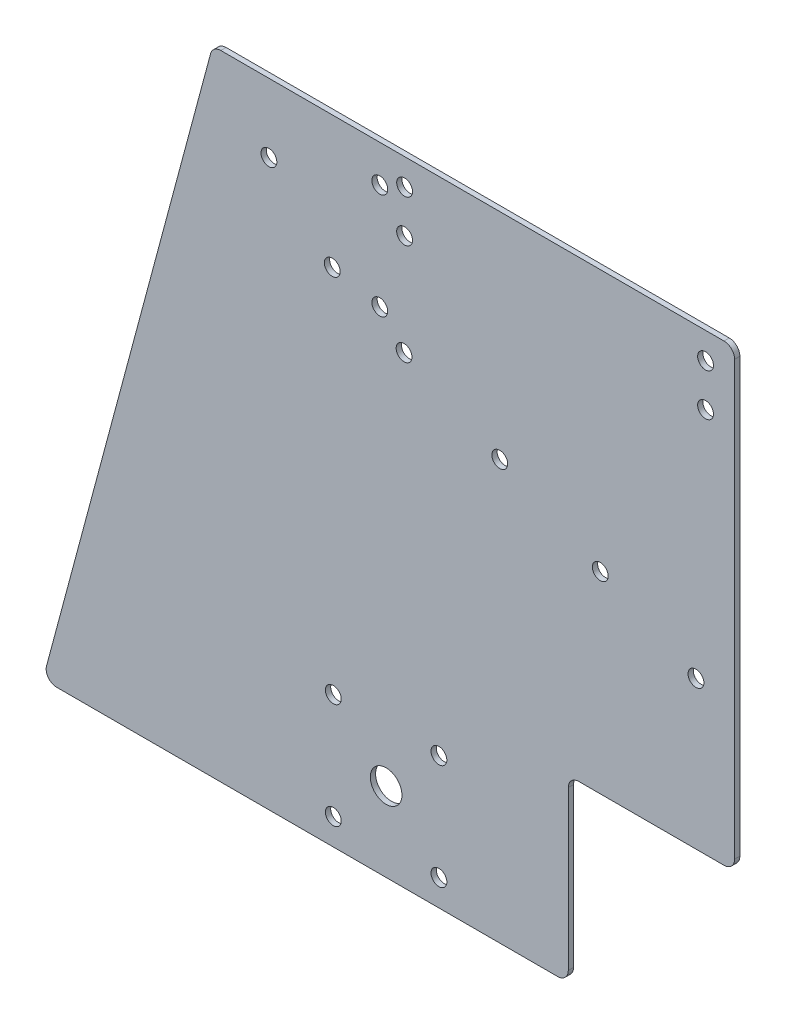
ISO-10303-21;
HEADER;
FILE_DESCRIPTION(('STEP AP214'),'2;1');
FILE_NAME('part.step','',(''),(''),'','','');
FILE_SCHEMA(('AUTOMOTIVE_DESIGN { 1 0 10303 214 1 1 1 1 }'));
ENDSEC;
DATA;
#1=APPLICATION_CONTEXT('core data for automotive mechanical design processes');
#2=APPLICATION_PROTOCOL_DEFINITION('international standard','automotive_design',2000,#1);
#3=PRODUCT_CONTEXT('',#1,'mechanical');
#4=PRODUCT('Part','Part','',(#3));
#5=PRODUCT_RELATED_PRODUCT_CATEGORY('part','',(#4));
#6=PRODUCT_DEFINITION_FORMATION('','',#4);
#7=PRODUCT_DEFINITION_CONTEXT('part definition',#1,'design');
#8=PRODUCT_DEFINITION('design','',#6,#7);
#9=PRODUCT_DEFINITION_SHAPE('','',#8);
#10=(LENGTH_UNIT() NAMED_UNIT(*) SI_UNIT(.MILLI.,.METRE.));
#11=(NAMED_UNIT(*) PLANE_ANGLE_UNIT() SI_UNIT($,.RADIAN.));
#12=(NAMED_UNIT(*) SI_UNIT($,.STERADIAN.) SOLID_ANGLE_UNIT());
#13=UNCERTAINTY_MEASURE_WITH_UNIT(LENGTH_MEASURE(1.E-05),#10,'distance_accuracy_value','');
#14=(GEOMETRIC_REPRESENTATION_CONTEXT(3) GLOBAL_UNCERTAINTY_ASSIGNED_CONTEXT((#13)) GLOBAL_UNIT_ASSIGNED_CONTEXT((#10,
#11,#12)) REPRESENTATION_CONTEXT('',''));
#15=CARTESIAN_POINT('',(0.,0.,0.));
#16=DIRECTION('',(0.,0.,1.));
#17=DIRECTION('',(1.,0.,0.));
#18=AXIS2_PLACEMENT_3D('',#15,#16,#17);
#19=CARTESIAN_POINT('',(0.,0.,1.));
#20=DIRECTION('',(0.,0.,-1.));
#21=DIRECTION('',(-1.,0.,0.));
#22=AXIS2_PLACEMENT_3D('',#19,#20,#21);
#23=PLANE('',#22);
#24=CARTESIAN_POINT('',(-19.5,115.,1.));
#25=DIRECTION('',(0.,0.,-1.));
#26=DIRECTION('',(-1.,0.,0.));
#27=AXIS2_PLACEMENT_3D('',#24,#25,#26);
#28=CIRCLE('',#27,1.5);
#29=CARTESIAN_POINT('',(-21.,115.,1.));
#30=VERTEX_POINT('',#29);
#31=EDGE_CURVE('E226',#30,#30,#28,.T.);
#32=ORIENTED_EDGE('',*,*,#31,.T.);
#33=EDGE_LOOP('',(#32));
#34=FACE_BOUND('',#33,.T.);
#35=CARTESIAN_POINT('',(-19.5,107.,1.));
#36=DIRECTION('',(0.,0.,-1.));
#37=DIRECTION('',(-1.,0.,0.));
#38=AXIS2_PLACEMENT_3D('',#35,#36,#37);
#39=CIRCLE('',#38,1.50000000000001);
#40=CARTESIAN_POINT('',(-21.,107.,1.));
#41=VERTEX_POINT('',#40);
#42=EDGE_CURVE('E571',#41,#41,#39,.T.);
#43=ORIENTED_EDGE('',*,*,#42,.T.);
#44=EDGE_LOOP('',(#43));
#45=FACE_BOUND('',#44,.T.);
#46=CARTESIAN_POINT('',(-76.5,107.,1.));
#47=DIRECTION('',(0.,0.,-1.));
#48=DIRECTION('',(-1.,0.,0.));
#49=AXIS2_PLACEMENT_3D('',#46,#47,#48);
#50=CIRCLE('',#49,1.5);
#51=CARTESIAN_POINT('',(-78.,107.,1.));
#52=VERTEX_POINT('',#51);
#53=EDGE_CURVE('E577',#52,#52,#50,.T.);
#54=ORIENTED_EDGE('',*,*,#53,.T.);
#55=EDGE_LOOP('',(#54));
#56=FACE_BOUND('',#55,.T.);
#57=CARTESIAN_POINT('',(-76.5,115.,1.));
#58=DIRECTION('',(0.,0.,-1.));
#59=DIRECTION('',(-1.,0.,0.));
#60=AXIS2_PLACEMENT_3D('',#57,#58,#59);
#61=CIRCLE('',#60,1.5);
#62=CARTESIAN_POINT('',(-78.,115.,1.));
#63=VERTEX_POINT('',#62);
#64=EDGE_CURVE('E170',#63,#63,#61,.T.);
#65=ORIENTED_EDGE('',*,*,#64,.T.);
#66=EDGE_LOOP('',(#65));
#67=FACE_BOUND('',#66,.T.);
#68=CARTESIAN_POINT('',(-81.2,113.,0.999999999999999));
#69=DIRECTION('',(0.,0.,-1.));
#70=DIRECTION('',(-1.,0.,0.));
#71=AXIS2_PLACEMENT_3D('',#68,#69,#70);
#72=CIRCLE('',#71,1.5);
#73=CARTESIAN_POINT('',(-82.7,113.,0.999999999999999));
#74=VERTEX_POINT('',#73);
#75=EDGE_CURVE('E507',#74,#74,#72,.T.);
#76=ORIENTED_EDGE('',*,*,#75,.T.);
#77=EDGE_LOOP('',(#76));
#78=FACE_BOUND('',#77,.T.);
#79=CARTESIAN_POINT('',(-81.2,93.,0.999999999999999));
#80=DIRECTION('',(0.,0.,-1.));
#81=DIRECTION('',(-1.,0.,0.));
#82=AXIS2_PLACEMENT_3D('',#79,#80,#81);
#83=CIRCLE('',#82,1.5);
#84=CARTESIAN_POINT('',(-82.7,93.,0.999999999999999));
#85=VERTEX_POINT('',#84);
#86=EDGE_CURVE('E504',#85,#85,#83,.T.);
#87=ORIENTED_EDGE('',*,*,#86,.T.);
#88=EDGE_LOOP('',(#87));
#89=FACE_BOUND('',#88,.T.);
#90=CARTESIAN_POINT('',(-76.5992397684817,87.7972227455316,1.));
#91=DIRECTION('',(0.,0.,-1.));
#92=DIRECTION('',(-1.,0.,0.));
#93=AXIS2_PLACEMENT_3D('',#90,#91,#92);
#94=CIRCLE('',#93,1.5);
#95=CARTESIAN_POINT('',(-78.0992397684817,87.7972227455316,1.));
#96=VERTEX_POINT('',#95);
#97=EDGE_CURVE('E475',#96,#96,#94,.T.);
#98=ORIENTED_EDGE('',*,*,#97,.T.);
#99=EDGE_LOOP('',(#98));
#100=FACE_BOUND('',#99,.T.);
#101=CARTESIAN_POINT('',(-21.3144647592461,62.0175087793489,1.));
#102=DIRECTION('',(0.,0.,-1.));
#103=DIRECTION('',(-1.,0.,0.));
#104=AXIS2_PLACEMENT_3D('',#101,#102,#103);
#105=CIRCLE('',#104,1.5);
#106=CARTESIAN_POINT('',(-22.8144647592461,62.0175087793489,1.));
#107=VERTEX_POINT('',#106);
#108=EDGE_CURVE('E495',#107,#107,#105,.T.);
#109=ORIENTED_EDGE('',*,*,#108,.T.);
#110=EDGE_LOOP('',(#109));
#111=FACE_BOUND('',#110,.T.);
#112=CARTESIAN_POINT('',(-39.4406204999791,70.4698740141629,1.));
#113=DIRECTION('',(0.,0.,-1.));
#114=DIRECTION('',(-1.,0.,0.));
#115=AXIS2_PLACEMENT_3D('',#112,#113,#114);
#116=CIRCLE('',#115,1.5);
#117=CARTESIAN_POINT('',(-40.9406204999791,70.4698740141629,1.));
#118=VERTEX_POINT('',#117);
#119=EDGE_CURVE('E490',#118,#118,#116,.T.);
#120=ORIENTED_EDGE('',*,*,#119,.T.);
#121=EDGE_LOOP('',(#120));
#122=FACE_BOUND('',#121,.T.);
#123=CARTESIAN_POINT('',(-58.4730840277487,79.3448575107176,1.));
#124=DIRECTION('',(0.,0.,-1.));
#125=DIRECTION('',(-1.,0.,0.));
#126=AXIS2_PLACEMENT_3D('',#123,#124,#125);
#127=CIRCLE('',#126,1.5);
#128=CARTESIAN_POINT('',(-59.9730840277487,79.3448575107176,1.));
#129=VERTEX_POINT('',#128);
#130=EDGE_CURVE('E486',#129,#129,#127,.T.);
#131=ORIENTED_EDGE('',*,*,#130,.T.);
#132=EDGE_LOOP('',(#131));
#133=FACE_BOUND('',#132,.T.);
#134=CARTESIAN_POINT('',(-102.2,107.,1.));
#135=DIRECTION('',(0.,0.,1.));
#136=DIRECTION('',(1.,0.,0.));
#137=AXIS2_PLACEMENT_3D('',#134,#135,#136);
#138=CIRCLE('',#137,1.5);
#139=CARTESIAN_POINT('',(-100.7,107.,1.));
#140=VERTEX_POINT('',#139);
#141=EDGE_CURVE('E265',#140,#140,#138,.T.);
#142=ORIENTED_EDGE('',*,*,#141,.F.);
#143=EDGE_LOOP('',(#142));
#144=FACE_BOUND('',#143,.T.);
#145=CARTESIAN_POINT('',(-90.2,95.,1.));
#146=DIRECTION('',(0.,0.,1.));
#147=DIRECTION('',(1.,0.,0.));
#148=AXIS2_PLACEMENT_3D('',#145,#146,#147);
#149=CIRCLE('',#148,1.5);
#150=CARTESIAN_POINT('',(-88.7,95.,1.));
#151=VERTEX_POINT('',#150);
#152=EDGE_CURVE('E471',#151,#151,#149,.T.);
#153=ORIENTED_EDGE('',*,*,#152,.F.);
#154=EDGE_LOOP('',(#153));
#155=FACE_BOUND('',#154,.T.);
#156=DIRECTION('',(1.,0.,0.));
#157=VECTOR('',#156,1.);
#158=CARTESIAN_POINT('',(0.,34.,1.));
#159=LINE('',#158,#157);
#160=CARTESIAN_POINT('',(-43.5,34.,1.));
#161=VERTEX_POINT('',#160);
#162=CARTESIAN_POINT('',(-16.,34.,1.));
#163=VERTEX_POINT('',#162);
#164=EDGE_CURVE('E210',#161,#163,#159,.T.);
#165=ORIENTED_EDGE('',*,*,#164,.T.);
#166=CARTESIAN_POINT('',(-16.,36.,0.999999999999999));
#167=DIRECTION('',(0.,0.,-1.));
#168=DIRECTION('',(-1.,0.,0.));
#169=AXIS2_PLACEMENT_3D('',#166,#167,#168);
#170=CIRCLE('',#169,2.);
#171=CARTESIAN_POINT('',(-14.,36.,1.));
#172=VERTEX_POINT('',#171);
#173=EDGE_CURVE('E57',#163,#172,#170,.F.);
#174=ORIENTED_EDGE('',*,*,#173,.T.);
#175=DIRECTION('',(0.,1.,0.));
#176=VECTOR('',#175,1.);
#177=CARTESIAN_POINT('',(-14.,0.,1.));
#178=LINE('',#177,#176);
#179=CARTESIAN_POINT('',(-14.,118.,1.));
#180=VERTEX_POINT('',#179);
#181=EDGE_CURVE('E209',#172,#180,#178,.T.);
#182=ORIENTED_EDGE('',*,*,#181,.T.);
#183=CARTESIAN_POINT('',(-16.,118.,1.));
#184=DIRECTION('',(0.,0.,-1.));
#185=DIRECTION('',(-1.,0.,0.));
#186=AXIS2_PLACEMENT_3D('',#183,#184,#185);
#187=CIRCLE('',#186,2.);
#188=CARTESIAN_POINT('',(-16.,120.,1.));
#189=VERTEX_POINT('',#188);
#190=EDGE_CURVE('E64',#180,#189,#187,.F.);
#191=ORIENTED_EDGE('',*,*,#190,.T.);
#192=DIRECTION('',(-1.,0.,0.));
#193=VECTOR('',#192,1.);
#194=CARTESIAN_POINT('',(-112.846096908265,120.,1.));
#195=LINE('',#194,#193);
#196=CARTESIAN_POINT('',(-111.311442932307,120.,1.));
#197=VERTEX_POINT('',#196);
#198=EDGE_CURVE('E242',#189,#197,#195,.T.);
#199=ORIENTED_EDGE('',*,*,#198,.T.);
#200=CARTESIAN_POINT('',(-111.311442932307,118.,1.));
#201=DIRECTION('',(0.,0.,-1.));
#202=DIRECTION('',(-1.,0.,0.));
#203=AXIS2_PLACEMENT_3D('',#200,#201,#202);
#204=CIRCLE('',#203,2.);
#205=CARTESIAN_POINT('',(-113.243294584885,118.517638090205,1.));
#206=VERTEX_POINT('',#205);
#207=EDGE_CURVE('E276',#197,#206,#204,.F.);
#208=ORIENTED_EDGE('',*,*,#207,.T.);
#209=DIRECTION('',(-0.258819045102525,-0.965925826289067,0.));
#210=VECTOR('',#209,1.);
#211=CARTESIAN_POINT('',(-145.,0.,1.));
#212=LINE('',#211,#210);
#213=CARTESIAN_POINT('',(-144.325400906896,2.51763809020504,1.));
#214=VERTEX_POINT('',#213);
#215=EDGE_CURVE('E245',#206,#214,#212,.T.);
#216=ORIENTED_EDGE('',*,*,#215,.T.);
#217=CARTESIAN_POINT('',(-142.393549254318,1.99999999999998,1.));
#218=DIRECTION('',(0.,0.,-1.));
#219=DIRECTION('',(-1.,0.,0.));
#220=AXIS2_PLACEMENT_3D('',#217,#218,#219);
#221=CIRCLE('',#220,2.);
#222=CARTESIAN_POINT('',(-142.393549254318,0.,1.));
#223=VERTEX_POINT('',#222);
#224=EDGE_CURVE('E278',#214,#223,#221,.F.);
#225=ORIENTED_EDGE('',*,*,#224,.T.);
#226=DIRECTION('',(1.,0.,0.));
#227=VECTOR('',#226,1.);
#228=CARTESIAN_POINT('',(0.,0.,1.));
#229=LINE('',#228,#227);
#230=CARTESIAN_POINT('',(-47.5,0.,1.));
#231=VERTEX_POINT('',#230);
#232=EDGE_CURVE('E250',#223,#231,#229,.T.);
#233=ORIENTED_EDGE('',*,*,#232,.T.);
#234=CARTESIAN_POINT('',(-47.5,1.99999999999999,0.999999999999999));
#235=DIRECTION('',(0.,0.,-1.));
#236=DIRECTION('',(-1.,0.,0.));
#237=AXIS2_PLACEMENT_3D('',#234,#235,#236);
#238=CIRCLE('',#237,2.);
#239=CARTESIAN_POINT('',(-45.5,1.99999999999999,1.));
#240=VERTEX_POINT('',#239);
#241=EDGE_CURVE('E280',#231,#240,#238,.F.);
#242=ORIENTED_EDGE('',*,*,#241,.T.);
#243=DIRECTION('',(0.,1.,0.));
#244=VECTOR('',#243,1.);
#245=CARTESIAN_POINT('',(-45.5,0.,1.));
#246=LINE('',#245,#244);
#247=CARTESIAN_POINT('',(-45.5,32.,1.));
#248=VERTEX_POINT('',#247);
#249=EDGE_CURVE('E161',#240,#248,#246,.T.);
#250=ORIENTED_EDGE('',*,*,#249,.T.);
#251=CARTESIAN_POINT('',(-43.5,32.,0.999999999999999));
#252=DIRECTION('',(0.,0.,-1.));
#253=DIRECTION('',(-1.,0.,0.));
#254=AXIS2_PLACEMENT_3D('',#251,#252,#253);
#255=CIRCLE('',#254,2.);
#256=EDGE_CURVE('E191',#248,#161,#255,.T.);
#257=ORIENTED_EDGE('',*,*,#256,.T.);
#258=EDGE_LOOP('',(#165,#174,#182,#191,#199,#208,#216,#225,#233,#242,#250,#257));
#259=FACE_BOUND('',#258,.T.);
#260=CARTESIAN_POINT('',(-70.,25.,1.));
#261=DIRECTION('',(0.,0.,1.));
#262=DIRECTION('',(1.,0.,0.));
#263=AXIS2_PLACEMENT_3D('',#260,#261,#262);
#264=CIRCLE('',#263,1.5);
#265=CARTESIAN_POINT('',(-68.5,25.,1.));
#266=VERTEX_POINT('',#265);
#267=EDGE_CURVE('E257',#266,#266,#264,.T.);
#268=ORIENTED_EDGE('',*,*,#267,.F.);
#269=EDGE_LOOP('',(#268));
#270=FACE_BOUND('',#269,.T.);
#271=CARTESIAN_POINT('',(-90.,25.,1.));
#272=DIRECTION('',(0.,0.,1.));
#273=DIRECTION('',(1.,0.,0.));
#274=AXIS2_PLACEMENT_3D('',#271,#272,#273);
#275=CIRCLE('',#274,1.5);
#276=CARTESIAN_POINT('',(-88.5,25.,1.));
#277=VERTEX_POINT('',#276);
#278=EDGE_CURVE('E424',#277,#277,#275,.T.);
#279=ORIENTED_EDGE('',*,*,#278,.F.);
#280=EDGE_LOOP('',(#279));
#281=FACE_BOUND('',#280,.T.);
#282=CARTESIAN_POINT('',(-80.,15.,1.));
#283=DIRECTION('',(0.,0.,1.));
#284=DIRECTION('',(1.,0.,0.));
#285=AXIS2_PLACEMENT_3D('',#282,#283,#284);
#286=CIRCLE('',#285,2.99999999999999);
#287=CARTESIAN_POINT('',(-77.,15.,1.));
#288=VERTEX_POINT('',#287);
#289=EDGE_CURVE('E429',#288,#288,#286,.T.);
#290=ORIENTED_EDGE('',*,*,#289,.F.);
#291=EDGE_LOOP('',(#290));
#292=FACE_BOUND('',#291,.T.);
#293=CARTESIAN_POINT('',(-70.,4.99999999999998,1.));
#294=DIRECTION('',(0.,0.,1.));
#295=DIRECTION('',(1.,0.,0.));
#296=AXIS2_PLACEMENT_3D('',#293,#294,#295);
#297=CIRCLE('',#296,1.5);
#298=CARTESIAN_POINT('',(-68.5,4.99999999999998,1.));
#299=VERTEX_POINT('',#298);
#300=EDGE_CURVE('E457',#299,#299,#297,.T.);
#301=ORIENTED_EDGE('',*,*,#300,.F.);
#302=EDGE_LOOP('',(#301));
#303=FACE_BOUND('',#302,.T.);
#304=CARTESIAN_POINT('',(-90.,4.99999999999998,1.));
#305=DIRECTION('',(0.,0.,1.));
#306=DIRECTION('',(1.,0.,0.));
#307=AXIS2_PLACEMENT_3D('',#304,#305,#306);
#308=CIRCLE('',#307,1.5);
#309=CARTESIAN_POINT('',(-88.5,4.99999999999998,1.));
#310=VERTEX_POINT('',#309);
#311=EDGE_CURVE('E451',#310,#310,#308,.T.);
#312=ORIENTED_EDGE('',*,*,#311,.F.);
#313=EDGE_LOOP('',(#312));
#314=FACE_BOUND('',#313,.T.);
#315=ADVANCED_FACE('F49',(#34,#45,#56,#67,#78,#89,#100,#111,#122,#133,#144,#155,#259,#270,#281,
#292,#303,#314),#23,.F.);
#316=CARTESIAN_POINT('',(0.,0.,0.));
#317=DIRECTION('',(0.,0.,-1.));
#318=DIRECTION('',(-1.,0.,0.));
#319=AXIS2_PLACEMENT_3D('',#316,#317,#318);
#320=PLANE('',#319);
#321=DIRECTION('',(0.,1.,0.));
#322=VECTOR('',#321,1.);
#323=CARTESIAN_POINT('',(-14.,120.,0.));
#324=LINE('',#323,#322);
#325=CARTESIAN_POINT('',(-14.,36.,0.));
#326=VERTEX_POINT('',#325);
#327=CARTESIAN_POINT('',(-14.,118.,0.));
#328=VERTEX_POINT('',#327);
#329=EDGE_CURVE('E218',#326,#328,#324,.T.);
#330=ORIENTED_EDGE('',*,*,#329,.F.);
#331=CARTESIAN_POINT('',(-16.,36.,0.));
#332=DIRECTION('',(0.,0.,-1.));
#333=DIRECTION('',(-1.,0.,0.));
#334=AXIS2_PLACEMENT_3D('',#331,#332,#333);
#335=CIRCLE('',#334,2.);
#336=CARTESIAN_POINT('',(-16.,34.,0.));
#337=VERTEX_POINT('',#336);
#338=EDGE_CURVE('E203',#326,#337,#335,.T.);
#339=ORIENTED_EDGE('',*,*,#338,.T.);
#340=DIRECTION('',(1.,0.,0.));
#341=VECTOR('',#340,1.);
#342=CARTESIAN_POINT('',(46.5,34.,0.));
#343=LINE('',#342,#341);
#344=CARTESIAN_POINT('',(-43.5,34.,0.));
#345=VERTEX_POINT('',#344);
#346=EDGE_CURVE('E217',#345,#337,#343,.T.);
#347=ORIENTED_EDGE('',*,*,#346,.F.);
#348=CARTESIAN_POINT('',(-43.5,32.,0.));
#349=DIRECTION('',(0.,0.,-1.));
#350=DIRECTION('',(-1.,0.,0.));
#351=AXIS2_PLACEMENT_3D('',#348,#349,#350);
#352=CIRCLE('',#351,2.);
#353=CARTESIAN_POINT('',(-45.5,32.,0.));
#354=VERTEX_POINT('',#353);
#355=EDGE_CURVE('E169',#345,#354,#352,.F.);
#356=ORIENTED_EDGE('',*,*,#355,.T.);
#357=DIRECTION('',(0.,1.,0.));
#358=VECTOR('',#357,1.);
#359=CARTESIAN_POINT('',(-45.5,0.,0.));
#360=LINE('',#359,#358);
#361=CARTESIAN_POINT('',(-45.5,1.99999999999999,0.));
#362=VERTEX_POINT('',#361);
#363=EDGE_CURVE('E158',#362,#354,#360,.T.);
#364=ORIENTED_EDGE('',*,*,#363,.F.);
#365=CARTESIAN_POINT('',(-47.5,1.99999999999999,0.));
#366=DIRECTION('',(0.,0.,-1.));
#367=DIRECTION('',(-1.,0.,0.));
#368=AXIS2_PLACEMENT_3D('',#365,#366,#367);
#369=CIRCLE('',#368,2.);
#370=CARTESIAN_POINT('',(-47.5,0.,0.));
#371=VERTEX_POINT('',#370);
#372=EDGE_CURVE('E141',#362,#371,#369,.T.);
#373=ORIENTED_EDGE('',*,*,#372,.T.);
#374=DIRECTION('',(1.,0.,0.));
#375=VECTOR('',#374,1.);
#376=CARTESIAN_POINT('',(0.,0.,0.));
#377=LINE('',#376,#375);
#378=CARTESIAN_POINT('',(-142.393549254318,0.,0.));
#379=VERTEX_POINT('',#378);
#380=EDGE_CURVE('E246',#379,#371,#377,.T.);
#381=ORIENTED_EDGE('',*,*,#380,.F.);
#382=CARTESIAN_POINT('',(-142.393549254318,1.99999999999998,0.));
#383=DIRECTION('',(0.,0.,-1.));
#384=DIRECTION('',(-1.,0.,0.));
#385=AXIS2_PLACEMENT_3D('',#382,#383,#384);
#386=CIRCLE('',#385,2.);
#387=CARTESIAN_POINT('',(-144.325400906896,2.51763809020504,0.));
#388=VERTEX_POINT('',#387);
#389=EDGE_CURVE('E152',#379,#388,#386,.T.);
#390=ORIENTED_EDGE('',*,*,#389,.T.);
#391=DIRECTION('',(-0.258819045102525,-0.965925826289067,0.));
#392=VECTOR('',#391,1.);
#393=CARTESIAN_POINT('',(-145.,0.,0.));
#394=LINE('',#393,#392);
#395=CARTESIAN_POINT('',(-113.243294584885,118.517638090205,0.));
#396=VERTEX_POINT('',#395);
#397=EDGE_CURVE('E256',#396,#388,#394,.T.);
#398=ORIENTED_EDGE('',*,*,#397,.F.);
#399=CARTESIAN_POINT('',(-111.311442932307,118.,0.));
#400=DIRECTION('',(0.,0.,-1.));
#401=DIRECTION('',(-1.,0.,0.));
#402=AXIS2_PLACEMENT_3D('',#399,#400,#401);
#403=CIRCLE('',#402,2.);
#404=CARTESIAN_POINT('',(-111.311442932307,120.,0.));
#405=VERTEX_POINT('',#404);
#406=EDGE_CURVE('E162',#396,#405,#403,.T.);
#407=ORIENTED_EDGE('',*,*,#406,.T.);
#408=DIRECTION('',(-1.,0.,0.));
#409=VECTOR('',#408,1.);
#410=CARTESIAN_POINT('',(-112.846096908265,120.,0.));
#411=LINE('',#410,#409);
#412=CARTESIAN_POINT('',(-16.,120.,0.));
#413=VERTEX_POINT('',#412);
#414=EDGE_CURVE('E254',#413,#405,#411,.T.);
#415=ORIENTED_EDGE('',*,*,#414,.F.);
#416=CARTESIAN_POINT('',(-16.,118.,0.));
#417=DIRECTION('',(0.,0.,-1.));
#418=DIRECTION('',(-1.,0.,0.));
#419=AXIS2_PLACEMENT_3D('',#416,#417,#418);
#420=CIRCLE('',#419,2.);
#421=EDGE_CURVE('E201',#413,#328,#420,.T.);
#422=ORIENTED_EDGE('',*,*,#421,.T.);
#423=EDGE_LOOP('',(#330,#339,#347,#356,#364,#373,#381,#390,#398,#407,#415,#422));
#424=FACE_BOUND('',#423,.T.);
#425=CARTESIAN_POINT('',(-19.5,115.,0.));
#426=DIRECTION('',(0.,0.,-1.));
#427=DIRECTION('',(-1.,0.,0.));
#428=AXIS2_PLACEMENT_3D('',#425,#426,#427);
#429=CIRCLE('',#428,1.5);
#430=CARTESIAN_POINT('',(-21.,115.,0.));
#431=VERTEX_POINT('',#430);
#432=EDGE_CURVE('E568',#431,#431,#429,.T.);
#433=ORIENTED_EDGE('',*,*,#432,.F.);
#434=EDGE_LOOP('',(#433));
#435=FACE_BOUND('',#434,.T.);
#436=CARTESIAN_POINT('',(-19.5,107.,0.));
#437=DIRECTION('',(0.,0.,-1.));
#438=DIRECTION('',(-1.,0.,0.));
#439=AXIS2_PLACEMENT_3D('',#436,#437,#438);
#440=CIRCLE('',#439,1.50000000000001);
#441=CARTESIAN_POINT('',(-21.,107.,0.));
#442=VERTEX_POINT('',#441);
#443=EDGE_CURVE('E575',#442,#442,#440,.T.);
#444=ORIENTED_EDGE('',*,*,#443,.F.);
#445=EDGE_LOOP('',(#444));
#446=FACE_BOUND('',#445,.T.);
#447=CARTESIAN_POINT('',(-76.5,107.,0.));
#448=DIRECTION('',(0.,0.,-1.));
#449=DIRECTION('',(-1.,0.,0.));
#450=AXIS2_PLACEMENT_3D('',#447,#448,#449);
#451=CIRCLE('',#450,1.5);
#452=CARTESIAN_POINT('',(-78.,107.,0.));
#453=VERTEX_POINT('',#452);
#454=EDGE_CURVE('E232',#453,#453,#451,.T.);
#455=ORIENTED_EDGE('',*,*,#454,.F.);
#456=EDGE_LOOP('',(#455));
#457=FACE_BOUND('',#456,.T.);
#458=CARTESIAN_POINT('',(-76.5,115.,0.));
#459=DIRECTION('',(0.,0.,-1.));
#460=DIRECTION('',(-1.,0.,0.));
#461=AXIS2_PLACEMENT_3D('',#458,#459,#460);
#462=CIRCLE('',#461,1.5);
#463=CARTESIAN_POINT('',(-78.,115.,0.));
#464=VERTEX_POINT('',#463);
#465=EDGE_CURVE('E175',#464,#464,#462,.T.);
#466=ORIENTED_EDGE('',*,*,#465,.F.);
#467=EDGE_LOOP('',(#466));
#468=FACE_BOUND('',#467,.T.);
#469=CARTESIAN_POINT('',(-81.2,113.,0.));
#470=DIRECTION('',(0.,0.,-1.));
#471=DIRECTION('',(-1.,0.,0.));
#472=AXIS2_PLACEMENT_3D('',#469,#470,#471);
#473=CIRCLE('',#472,1.5);
#474=CARTESIAN_POINT('',(-82.7,113.,0.));
#475=VERTEX_POINT('',#474);
#476=EDGE_CURVE('E180',#475,#475,#473,.T.);
#477=ORIENTED_EDGE('',*,*,#476,.F.);
#478=EDGE_LOOP('',(#477));
#479=FACE_BOUND('',#478,.T.);
#480=CARTESIAN_POINT('',(-81.2,93.,0.));
#481=DIRECTION('',(0.,0.,-1.));
#482=DIRECTION('',(-1.,0.,0.));
#483=AXIS2_PLACEMENT_3D('',#480,#481,#482);
#484=CIRCLE('',#483,1.5);
#485=CARTESIAN_POINT('',(-82.7,93.,0.));
#486=VERTEX_POINT('',#485);
#487=EDGE_CURVE('E172',#486,#486,#484,.T.);
#488=ORIENTED_EDGE('',*,*,#487,.F.);
#489=EDGE_LOOP('',(#488));
#490=FACE_BOUND('',#489,.T.);
#491=CARTESIAN_POINT('',(-76.5992397684817,87.7972227455316,0.));
#492=DIRECTION('',(0.,0.,-1.));
#493=DIRECTION('',(-1.,0.,0.));
#494=AXIS2_PLACEMENT_3D('',#491,#492,#493);
#495=CIRCLE('',#494,1.5);
#496=CARTESIAN_POINT('',(-78.0992397684817,87.7972227455316,0.));
#497=VERTEX_POINT('',#496);
#498=EDGE_CURVE('E515',#497,#497,#495,.T.);
#499=ORIENTED_EDGE('',*,*,#498,.F.);
#500=EDGE_LOOP('',(#499));
#501=FACE_BOUND('',#500,.T.);
#502=CARTESIAN_POINT('',(-21.3144647592461,62.0175087793489,0.));
#503=DIRECTION('',(0.,0.,-1.));
#504=DIRECTION('',(-1.,0.,0.));
#505=AXIS2_PLACEMENT_3D('',#502,#503,#504);
#506=CIRCLE('',#505,1.5);
#507=CARTESIAN_POINT('',(-22.8144647592461,62.0175087793489,0.));
#508=VERTEX_POINT('',#507);
#509=EDGE_CURVE('E514',#508,#508,#506,.T.);
#510=ORIENTED_EDGE('',*,*,#509,.F.);
#511=EDGE_LOOP('',(#510));
#512=FACE_BOUND('',#511,.T.);
#513=CARTESIAN_POINT('',(-39.4406204999791,70.4698740141629,0.));
#514=DIRECTION('',(0.,0.,-1.));
#515=DIRECTION('',(-1.,0.,0.));
#516=AXIS2_PLACEMENT_3D('',#513,#514,#515);
#517=CIRCLE('',#516,1.5);
#518=CARTESIAN_POINT('',(-40.9406204999791,70.4698740141629,0.));
#519=VERTEX_POINT('',#518);
#520=EDGE_CURVE('E511',#519,#519,#517,.T.);
#521=ORIENTED_EDGE('',*,*,#520,.F.);
#522=EDGE_LOOP('',(#521));
#523=FACE_BOUND('',#522,.T.);
#524=CARTESIAN_POINT('',(-58.4730840277487,79.3448575107176,0.));
#525=DIRECTION('',(0.,0.,-1.));
#526=DIRECTION('',(-1.,0.,0.));
#527=AXIS2_PLACEMENT_3D('',#524,#525,#526);
#528=CIRCLE('',#527,1.5);
#529=CARTESIAN_POINT('',(-59.9730840277487,79.3448575107176,0.));
#530=VERTEX_POINT('',#529);
#531=EDGE_CURVE('E491',#530,#530,#528,.T.);
#532=ORIENTED_EDGE('',*,*,#531,.F.);
#533=EDGE_LOOP('',(#532));
#534=FACE_BOUND('',#533,.T.);
#535=CARTESIAN_POINT('',(-102.2,107.,0.));
#536=DIRECTION('',(0.,0.,-1.));
#537=DIRECTION('',(-1.,0.,0.));
#538=AXIS2_PLACEMENT_3D('',#535,#536,#537);
#539=CIRCLE('',#538,1.5);
#540=CARTESIAN_POINT('',(-103.7,107.,0.));
#541=VERTEX_POINT('',#540);
#542=EDGE_CURVE('E264',#541,#541,#539,.T.);
#543=ORIENTED_EDGE('',*,*,#542,.F.);
#544=EDGE_LOOP('',(#543));
#545=FACE_BOUND('',#544,.T.);
#546=CARTESIAN_POINT('',(-90.2,95.,0.));
#547=DIRECTION('',(0.,0.,-1.));
#548=DIRECTION('',(-1.,0.,0.));
#549=AXIS2_PLACEMENT_3D('',#546,#547,#548);
#550=CIRCLE('',#549,1.5);
#551=CARTESIAN_POINT('',(-91.7,95.,0.));
#552=VERTEX_POINT('',#551);
#553=EDGE_CURVE('E261',#552,#552,#550,.T.);
#554=ORIENTED_EDGE('',*,*,#553,.F.);
#555=EDGE_LOOP('',(#554));
#556=FACE_BOUND('',#555,.T.);
#557=CARTESIAN_POINT('',(-70.,4.99999999999998,0.));
#558=DIRECTION('',(0.,0.,1.));
#559=DIRECTION('',(1.,0.,0.));
#560=AXIS2_PLACEMENT_3D('',#557,#558,#559);
#561=CIRCLE('',#560,1.5);
#562=CARTESIAN_POINT('',(-68.5,4.99999999999998,0.));
#563=VERTEX_POINT('',#562);
#564=EDGE_CURVE('E454',#563,#563,#561,.T.);
#565=ORIENTED_EDGE('',*,*,#564,.T.);
#566=EDGE_LOOP('',(#565));
#567=FACE_BOUND('',#566,.T.);
#568=CARTESIAN_POINT('',(-90.,25.,0.));
#569=DIRECTION('',(0.,0.,1.));
#570=DIRECTION('',(1.,0.,0.));
#571=AXIS2_PLACEMENT_3D('',#568,#569,#570);
#572=CIRCLE('',#571,1.5);
#573=CARTESIAN_POINT('',(-88.5,25.,0.));
#574=VERTEX_POINT('',#573);
#575=EDGE_CURVE('E427',#574,#574,#572,.T.);
#576=ORIENTED_EDGE('',*,*,#575,.T.);
#577=EDGE_LOOP('',(#576));
#578=FACE_BOUND('',#577,.T.);
#579=CARTESIAN_POINT('',(-70.,25.,0.));
#580=DIRECTION('',(0.,0.,1.));
#581=DIRECTION('',(1.,0.,0.));
#582=AXIS2_PLACEMENT_3D('',#579,#580,#581);
#583=CIRCLE('',#582,1.5);
#584=CARTESIAN_POINT('',(-68.5,25.,0.));
#585=VERTEX_POINT('',#584);
#586=EDGE_CURVE('E247',#585,#585,#583,.T.);
#587=ORIENTED_EDGE('',*,*,#586,.T.);
#588=EDGE_LOOP('',(#587));
#589=FACE_BOUND('',#588,.T.);
#590=CARTESIAN_POINT('',(-80.,15.,0.));
#591=DIRECTION('',(0.,0.,1.));
#592=DIRECTION('',(1.,0.,0.));
#593=AXIS2_PLACEMENT_3D('',#590,#591,#592);
#594=CIRCLE('',#593,2.99999999999999);
#595=CARTESIAN_POINT('',(-77.,15.,0.));
#596=VERTEX_POINT('',#595);
#597=EDGE_CURVE('E433',#596,#596,#594,.T.);
#598=ORIENTED_EDGE('',*,*,#597,.T.);
#599=EDGE_LOOP('',(#598));
#600=FACE_BOUND('',#599,.T.);
#601=CARTESIAN_POINT('',(-90.,4.99999999999998,0.));
#602=DIRECTION('',(0.,0.,1.));
#603=DIRECTION('',(1.,0.,0.));
#604=AXIS2_PLACEMENT_3D('',#601,#602,#603);
#605=CIRCLE('',#604,1.5);
#606=CARTESIAN_POINT('',(-88.5,4.99999999999998,0.));
#607=VERTEX_POINT('',#606);
#608=EDGE_CURVE('E268',#607,#607,#605,.T.);
#609=ORIENTED_EDGE('',*,*,#608,.T.);
#610=EDGE_LOOP('',(#609));
#611=FACE_BOUND('',#610,.T.);
#612=ADVANCED_FACE('F166',(#424,#435,#446,#457,#468,#479,#490,#501,#512,#523,#534,#545,#556,
#567,#578,#589,#600,#611),#320,.T.);
#613=CARTESIAN_POINT('',(-112.846096908265,120.,1.));
#614=DIRECTION('',(0.,-1.,0.));
#615=DIRECTION('',(0.,0.,-1.));
#616=AXIS2_PLACEMENT_3D('',#613,#614,#615);
#617=PLANE('',#616);
#618=ORIENTED_EDGE('',*,*,#198,.F.);
#619=DIRECTION('',(0.,0.,-1.));
#620=VECTOR('',#619,1.);
#621=CARTESIAN_POINT('',(-16.,120.,1.));
#622=LINE('',#621,#620);
#623=EDGE_CURVE('E12',#189,#413,#622,.T.);
#624=ORIENTED_EDGE('',*,*,#623,.T.);
#625=ORIENTED_EDGE('',*,*,#414,.T.);
#626=DIRECTION('',(0.,0.,-1.));
#627=VECTOR('',#626,1.);
#628=CARTESIAN_POINT('',(-111.311442932307,120.,1.));
#629=LINE('',#628,#627);
#630=EDGE_CURVE('E287',#405,#197,#629,.F.);
#631=ORIENTED_EDGE('',*,*,#630,.T.);
#632=EDGE_LOOP('',(#618,#624,#625,#631));
#633=FACE_BOUND('',#632,.T.);
#634=ADVANCED_FACE('F292',(#633),#617,.F.);
#635=CARTESIAN_POINT('',(-145.,0.,1.));
#636=DIRECTION('',(0.965925826289067,-0.258819045102525,0.));
#637=DIRECTION('',(0.258819045102525,0.965925826289067,0.));
#638=AXIS2_PLACEMENT_3D('',#635,#636,#637);
#639=PLANE('',#638);
#640=ORIENTED_EDGE('',*,*,#397,.T.);
#641=DIRECTION('',(0.,0.,-1.));
#642=VECTOR('',#641,1.);
#643=CARTESIAN_POINT('',(-144.325400906896,2.51763809020503,1.));
#644=LINE('',#643,#642);
#645=EDGE_CURVE('E285',#388,#214,#644,.F.);
#646=ORIENTED_EDGE('',*,*,#645,.T.);
#647=ORIENTED_EDGE('',*,*,#215,.F.);
#648=DIRECTION('',(0.,0.,-1.));
#649=VECTOR('',#648,1.);
#650=CARTESIAN_POINT('',(-113.243294584885,118.517638090205,1.));
#651=LINE('',#650,#649);
#652=EDGE_CURVE('E282',#206,#396,#651,.T.);
#653=ORIENTED_EDGE('',*,*,#652,.T.);
#654=EDGE_LOOP('',(#640,#646,#647,#653));
#655=FACE_BOUND('',#654,.T.);
#656=ADVANCED_FACE('F301',(#655),#639,.F.);
#657=CARTESIAN_POINT('',(0.,0.,1.));
#658=DIRECTION('',(0.,1.,0.));
#659=DIRECTION('',(-1.,0.,0.));
#660=AXIS2_PLACEMENT_3D('',#657,#658,#659);
#661=PLANE('',#660);
#662=ORIENTED_EDGE('',*,*,#380,.T.);
#663=DIRECTION('',(0.,0.,-1.));
#664=VECTOR('',#663,1.);
#665=CARTESIAN_POINT('',(-47.5,0.,1.));
#666=LINE('',#665,#664);
#667=EDGE_CURVE('E146',#371,#231,#666,.F.);
#668=ORIENTED_EDGE('',*,*,#667,.T.);
#669=ORIENTED_EDGE('',*,*,#232,.F.);
#670=DIRECTION('',(0.,0.,-1.));
#671=VECTOR('',#670,1.);
#672=CARTESIAN_POINT('',(-142.393549254318,0.,1.));
#673=LINE('',#672,#671);
#674=EDGE_CURVE('E151',#223,#379,#673,.T.);
#675=ORIENTED_EDGE('',*,*,#674,.T.);
#676=EDGE_LOOP('',(#662,#668,#669,#675));
#677=FACE_BOUND('',#676,.T.);
#678=ADVANCED_FACE('F309',(#677),#661,.F.);
#679=CARTESIAN_POINT('',(-70.,25.,1.));
#680=DIRECTION('',(0.,0.,-1.));
#681=DIRECTION('',(-1.,0.,0.));
#682=AXIS2_PLACEMENT_3D('',#679,#680,#681);
#683=CYLINDRICAL_SURFACE('',#682,1.5);
#684=ORIENTED_EDGE('',*,*,#267,.T.);
#685=EDGE_LOOP('',(#684));
#686=FACE_BOUND('',#685,.T.);
#687=ORIENTED_EDGE('',*,*,#586,.F.);
#688=EDGE_LOOP('',(#687));
#689=FACE_BOUND('',#688,.T.);
#690=ADVANCED_FACE('F325',(#686,#689),#683,.F.);
#691=CARTESIAN_POINT('',(-90.,25.,1.));
#692=DIRECTION('',(0.,0.,-1.));
#693=DIRECTION('',(-1.,0.,0.));
#694=AXIS2_PLACEMENT_3D('',#691,#692,#693);
#695=CYLINDRICAL_SURFACE('',#694,1.5);
#696=ORIENTED_EDGE('',*,*,#278,.T.);
#697=EDGE_LOOP('',(#696));
#698=FACE_BOUND('',#697,.T.);
#699=ORIENTED_EDGE('',*,*,#575,.F.);
#700=EDGE_LOOP('',(#699));
#701=FACE_BOUND('',#700,.T.);
#702=ADVANCED_FACE('F413',(#698,#701),#695,.F.);
#703=CARTESIAN_POINT('',(-80.,15.,1.));
#704=DIRECTION('',(0.,0.,-1.));
#705=DIRECTION('',(-1.,0.,0.));
#706=AXIS2_PLACEMENT_3D('',#703,#704,#705);
#707=CYLINDRICAL_SURFACE('',#706,2.99999999999999);
#708=ORIENTED_EDGE('',*,*,#289,.T.);
#709=EDGE_LOOP('',(#708));
#710=FACE_BOUND('',#709,.T.);
#711=ORIENTED_EDGE('',*,*,#597,.F.);
#712=EDGE_LOOP('',(#711));
#713=FACE_BOUND('',#712,.T.);
#714=ADVANCED_FACE('F410',(#710,#713),#707,.F.);
#715=CARTESIAN_POINT('',(-70.,4.99999999999998,1.));
#716=DIRECTION('',(0.,0.,-1.));
#717=DIRECTION('',(-1.,0.,0.));
#718=AXIS2_PLACEMENT_3D('',#715,#716,#717);
#719=CYLINDRICAL_SURFACE('',#718,1.5);
#720=ORIENTED_EDGE('',*,*,#300,.T.);
#721=EDGE_LOOP('',(#720));
#722=FACE_BOUND('',#721,.T.);
#723=ORIENTED_EDGE('',*,*,#564,.F.);
#724=EDGE_LOOP('',(#723));
#725=FACE_BOUND('',#724,.T.);
#726=ADVANCED_FACE('F406',(#722,#725),#719,.F.);
#727=CARTESIAN_POINT('',(-90.,4.99999999999998,1.));
#728=DIRECTION('',(0.,0.,-1.));
#729=DIRECTION('',(-1.,0.,0.));
#730=AXIS2_PLACEMENT_3D('',#727,#728,#729);
#731=CYLINDRICAL_SURFACE('',#730,1.5);
#732=ORIENTED_EDGE('',*,*,#311,.T.);
#733=EDGE_LOOP('',(#732));
#734=FACE_BOUND('',#733,.T.);
#735=ORIENTED_EDGE('',*,*,#608,.F.);
#736=EDGE_LOOP('',(#735));
#737=FACE_BOUND('',#736,.T.);
#738=ADVANCED_FACE('F402',(#734,#737),#731,.F.);
#739=CARTESIAN_POINT('',(-90.2,95.,-9.));
#740=DIRECTION('',(0.,0.,1.));
#741=DIRECTION('',(1.,0.,0.));
#742=AXIS2_PLACEMENT_3D('',#739,#740,#741);
#743=CYLINDRICAL_SURFACE('',#742,1.5);
#744=ORIENTED_EDGE('',*,*,#553,.T.);
#745=EDGE_LOOP('',(#744));
#746=FACE_BOUND('',#745,.T.);
#747=ORIENTED_EDGE('',*,*,#152,.T.);
#748=EDGE_LOOP('',(#747));
#749=FACE_BOUND('',#748,.T.);
#750=ADVANCED_FACE('F398',(#746,#749),#743,.F.);
#751=CARTESIAN_POINT('',(-102.2,107.,-9.));
#752=DIRECTION('',(0.,0.,1.));
#753=DIRECTION('',(1.,0.,0.));
#754=AXIS2_PLACEMENT_3D('',#751,#752,#753);
#755=CYLINDRICAL_SURFACE('',#754,1.5);
#756=ORIENTED_EDGE('',*,*,#542,.T.);
#757=EDGE_LOOP('',(#756));
#758=FACE_BOUND('',#757,.T.);
#759=ORIENTED_EDGE('',*,*,#141,.T.);
#760=EDGE_LOOP('',(#759));
#761=FACE_BOUND('',#760,.T.);
#762=ADVANCED_FACE('F394',(#758,#761),#755,.F.);
#763=CARTESIAN_POINT('',(-58.4730840277487,79.3448575107176,65.));
#764=DIRECTION('',(0.,0.,-1.));
#765=DIRECTION('',(-1.,0.,0.));
#766=AXIS2_PLACEMENT_3D('',#763,#764,#765);
#767=CYLINDRICAL_SURFACE('',#766,1.5);
#768=ORIENTED_EDGE('',*,*,#531,.T.);
#769=EDGE_LOOP('',(#768));
#770=FACE_BOUND('',#769,.T.);
#771=ORIENTED_EDGE('',*,*,#130,.F.);
#772=EDGE_LOOP('',(#771));
#773=FACE_BOUND('',#772,.T.);
#774=ADVANCED_FACE('F384',(#770,#773),#767,.F.);
#775=CARTESIAN_POINT('',(-39.4406204999791,70.4698740141629,65.));
#776=DIRECTION('',(0.,0.,-1.));
#777=DIRECTION('',(-1.,0.,0.));
#778=AXIS2_PLACEMENT_3D('',#775,#776,#777);
#779=CYLINDRICAL_SURFACE('',#778,1.5);
#780=ORIENTED_EDGE('',*,*,#520,.T.);
#781=EDGE_LOOP('',(#780));
#782=FACE_BOUND('',#781,.T.);
#783=ORIENTED_EDGE('',*,*,#119,.F.);
#784=EDGE_LOOP('',(#783));
#785=FACE_BOUND('',#784,.T.);
#786=ADVANCED_FACE('F380',(#782,#785),#779,.F.);
#787=CARTESIAN_POINT('',(-21.3144647592461,62.0175087793489,65.));
#788=DIRECTION('',(0.,0.,-1.));
#789=DIRECTION('',(-1.,0.,0.));
#790=AXIS2_PLACEMENT_3D('',#787,#788,#789);
#791=CYLINDRICAL_SURFACE('',#790,1.5);
#792=ORIENTED_EDGE('',*,*,#509,.T.);
#793=EDGE_LOOP('',(#792));
#794=FACE_BOUND('',#793,.T.);
#795=ORIENTED_EDGE('',*,*,#108,.F.);
#796=EDGE_LOOP('',(#795));
#797=FACE_BOUND('',#796,.T.);
#798=ADVANCED_FACE('F383',(#794,#797),#791,.F.);
#799=CARTESIAN_POINT('',(-76.5992397684817,87.7972227455316,65.));
#800=DIRECTION('',(0.,0.,-1.));
#801=DIRECTION('',(-1.,0.,0.));
#802=AXIS2_PLACEMENT_3D('',#799,#800,#801);
#803=CYLINDRICAL_SURFACE('',#802,1.5);
#804=ORIENTED_EDGE('',*,*,#498,.T.);
#805=EDGE_LOOP('',(#804));
#806=FACE_BOUND('',#805,.T.);
#807=ORIENTED_EDGE('',*,*,#97,.F.);
#808=EDGE_LOOP('',(#807));
#809=FACE_BOUND('',#808,.T.);
#810=ADVANCED_FACE('F378',(#806,#809),#803,.F.);
#811=CARTESIAN_POINT('',(-81.2,93.,10.));
#812=DIRECTION('',(0.,0.,-1.));
#813=DIRECTION('',(-1.,0.,0.));
#814=AXIS2_PLACEMENT_3D('',#811,#812,#813);
#815=CYLINDRICAL_SURFACE('',#814,1.5);
#816=ORIENTED_EDGE('',*,*,#487,.T.);
#817=EDGE_LOOP('',(#816));
#818=FACE_BOUND('',#817,.T.);
#819=ORIENTED_EDGE('',*,*,#86,.F.);
#820=EDGE_LOOP('',(#819));
#821=FACE_BOUND('',#820,.T.);
#822=ADVANCED_FACE('F374',(#818,#821),#815,.F.);
#823=CARTESIAN_POINT('',(-81.2,113.,10.));
#824=DIRECTION('',(0.,0.,-1.));
#825=DIRECTION('',(-1.,0.,0.));
#826=AXIS2_PLACEMENT_3D('',#823,#824,#825);
#827=CYLINDRICAL_SURFACE('',#826,1.5);
#828=ORIENTED_EDGE('',*,*,#476,.T.);
#829=EDGE_LOOP('',(#828));
#830=FACE_BOUND('',#829,.T.);
#831=ORIENTED_EDGE('',*,*,#75,.F.);
#832=EDGE_LOOP('',(#831));
#833=FACE_BOUND('',#832,.T.);
#834=ADVANCED_FACE('F371',(#830,#833),#827,.F.);
#835=CARTESIAN_POINT('',(-45.5,0.,10.));
#836=DIRECTION('',(-1.,0.,0.));
#837=DIRECTION('',(0.,0.,1.));
#838=AXIS2_PLACEMENT_3D('',#835,#836,#837);
#839=PLANE('',#838);
#840=ORIENTED_EDGE('',*,*,#249,.F.);
#841=DIRECTION('',(0.,0.,-1.));
#842=VECTOR('',#841,1.);
#843=CARTESIAN_POINT('',(-45.5,1.99999999999999,10.));
#844=LINE('',#843,#842);
#845=EDGE_CURVE('E145',#240,#362,#844,.T.);
#846=ORIENTED_EDGE('',*,*,#845,.T.);
#847=ORIENTED_EDGE('',*,*,#363,.T.);
#848=DIRECTION('',(0.,0.,-1.));
#849=VECTOR('',#848,1.);
#850=CARTESIAN_POINT('',(-45.5,32.,0.999999999999999));
#851=LINE('',#850,#849);
#852=EDGE_CURVE('E163',#354,#248,#851,.F.);
#853=ORIENTED_EDGE('',*,*,#852,.T.);
#854=EDGE_LOOP('',(#840,#846,#847,#853));
#855=FACE_BOUND('',#854,.T.);
#856=ADVANCED_FACE('F157',(#855),#839,.F.);
#857=CARTESIAN_POINT('',(-76.5,115.,1.));
#858=DIRECTION('',(0.,0.,-1.));
#859=DIRECTION('',(-1.,0.,0.));
#860=AXIS2_PLACEMENT_3D('',#857,#858,#859);
#861=CYLINDRICAL_SURFACE('',#860,1.5);
#862=ORIENTED_EDGE('',*,*,#64,.F.);
#863=EDGE_LOOP('',(#862));
#864=FACE_BOUND('',#863,.T.);
#865=ORIENTED_EDGE('',*,*,#465,.T.);
#866=EDGE_LOOP('',(#865));
#867=FACE_BOUND('',#866,.T.);
#868=ADVANCED_FACE('F358',(#864,#867),#861,.F.);
#869=CARTESIAN_POINT('',(-76.5,107.,1.));
#870=DIRECTION('',(0.,0.,-1.));
#871=DIRECTION('',(-1.,0.,0.));
#872=AXIS2_PLACEMENT_3D('',#869,#870,#871);
#873=CYLINDRICAL_SURFACE('',#872,1.5);
#874=ORIENTED_EDGE('',*,*,#53,.F.);
#875=EDGE_LOOP('',(#874));
#876=FACE_BOUND('',#875,.T.);
#877=ORIENTED_EDGE('',*,*,#454,.T.);
#878=EDGE_LOOP('',(#877));
#879=FACE_BOUND('',#878,.T.);
#880=ADVANCED_FACE('F354',(#876,#879),#873,.F.);
#881=CARTESIAN_POINT('',(-19.5,107.,1.));
#882=DIRECTION('',(0.,0.,-1.));
#883=DIRECTION('',(-1.,0.,0.));
#884=AXIS2_PLACEMENT_3D('',#881,#882,#883);
#885=CYLINDRICAL_SURFACE('',#884,1.50000000000001);
#886=ORIENTED_EDGE('',*,*,#42,.F.);
#887=EDGE_LOOP('',(#886));
#888=FACE_BOUND('',#887,.T.);
#889=ORIENTED_EDGE('',*,*,#443,.T.);
#890=EDGE_LOOP('',(#889));
#891=FACE_BOUND('',#890,.T.);
#892=ADVANCED_FACE('F357',(#888,#891),#885,.F.);
#893=CARTESIAN_POINT('',(-19.5,115.,1.));
#894=DIRECTION('',(0.,0.,-1.));
#895=DIRECTION('',(-1.,0.,0.));
#896=AXIS2_PLACEMENT_3D('',#893,#894,#895);
#897=CYLINDRICAL_SURFACE('',#896,1.5);
#898=ORIENTED_EDGE('',*,*,#31,.F.);
#899=EDGE_LOOP('',(#898));
#900=FACE_BOUND('',#899,.T.);
#901=ORIENTED_EDGE('',*,*,#432,.T.);
#902=EDGE_LOOP('',(#901));
#903=FACE_BOUND('',#902,.T.);
#904=ADVANCED_FACE('F353',(#900,#903),#897,.F.);
#905=CARTESIAN_POINT('',(46.5,34.,10.));
#906=DIRECTION('',(0.,1.,0.));
#907=DIRECTION('',(0.,0.,1.));
#908=AXIS2_PLACEMENT_3D('',#905,#906,#907);
#909=PLANE('',#908);
#910=ORIENTED_EDGE('',*,*,#346,.T.);
#911=DIRECTION('',(0.,0.,-1.));
#912=VECTOR('',#911,1.);
#913=CARTESIAN_POINT('',(-16.,34.,10.));
#914=LINE('',#913,#912);
#915=EDGE_CURVE('E72',#337,#163,#914,.F.);
#916=ORIENTED_EDGE('',*,*,#915,.T.);
#917=ORIENTED_EDGE('',*,*,#164,.F.);
#918=DIRECTION('',(0.,0.,-1.));
#919=VECTOR('',#918,1.);
#920=CARTESIAN_POINT('',(-43.5,34.,0.));
#921=LINE('',#920,#919);
#922=EDGE_CURVE('E224',#161,#345,#921,.T.);
#923=ORIENTED_EDGE('',*,*,#922,.T.);
#924=EDGE_LOOP('',(#910,#916,#917,#923));
#925=FACE_BOUND('',#924,.T.);
#926=ADVANCED_FACE('F222',(#925),#909,.F.);
#927=CARTESIAN_POINT('',(-47.5,1.99999999999999,10.));
#928=DIRECTION('',(0.,0.,-1.));
#929=DIRECTION('',(-1.,0.,0.));
#930=AXIS2_PLACEMENT_3D('',#927,#928,#929);
#931=CYLINDRICAL_SURFACE('',#930,2.);
#932=ORIENTED_EDGE('',*,*,#241,.F.);
#933=ORIENTED_EDGE('',*,*,#667,.F.);
#934=ORIENTED_EDGE('',*,*,#372,.F.);
#935=ORIENTED_EDGE('',*,*,#845,.F.);
#936=EDGE_LOOP('',(#932,#933,#934,#935));
#937=FACE_BOUND('',#936,.T.);
#938=ADVANCED_FACE('F144',(#937),#931,.T.);
#939=CARTESIAN_POINT('',(-142.393549254318,1.99999999999998,1.));
#940=DIRECTION('',(0.,0.,-1.));
#941=DIRECTION('',(-1.,0.,0.));
#942=AXIS2_PLACEMENT_3D('',#939,#940,#941);
#943=CYLINDRICAL_SURFACE('',#942,2.);
#944=ORIENTED_EDGE('',*,*,#224,.F.);
#945=ORIENTED_EDGE('',*,*,#645,.F.);
#946=ORIENTED_EDGE('',*,*,#389,.F.);
#947=ORIENTED_EDGE('',*,*,#674,.F.);
#948=EDGE_LOOP('',(#944,#945,#946,#947));
#949=FACE_BOUND('',#948,.T.);
#950=ADVANCED_FACE('F305',(#949),#943,.T.);
#951=CARTESIAN_POINT('',(-111.311442932307,118.,1.));
#952=DIRECTION('',(0.,0.,-1.));
#953=DIRECTION('',(-1.,0.,0.));
#954=AXIS2_PLACEMENT_3D('',#951,#952,#953);
#955=CYLINDRICAL_SURFACE('',#954,2.);
#956=ORIENTED_EDGE('',*,*,#207,.F.);
#957=ORIENTED_EDGE('',*,*,#630,.F.);
#958=ORIENTED_EDGE('',*,*,#406,.F.);
#959=ORIENTED_EDGE('',*,*,#652,.F.);
#960=EDGE_LOOP('',(#956,#957,#958,#959));
#961=FACE_BOUND('',#960,.T.);
#962=ADVANCED_FACE('F297',(#961),#955,.T.);
#963=CARTESIAN_POINT('',(-43.5,32.,10.));
#964=DIRECTION('',(0.,0.,1.));
#965=DIRECTION('',(1.,0.,0.));
#966=AXIS2_PLACEMENT_3D('',#963,#964,#965);
#967=CYLINDRICAL_SURFACE('',#966,2.);
#968=ORIENTED_EDGE('',*,*,#256,.F.);
#969=ORIENTED_EDGE('',*,*,#852,.F.);
#970=ORIENTED_EDGE('',*,*,#355,.F.);
#971=ORIENTED_EDGE('',*,*,#922,.F.);
#972=EDGE_LOOP('',(#968,#969,#970,#971));
#973=FACE_BOUND('',#972,.T.);
#974=ADVANCED_FACE('F340',(#973),#967,.F.);
#975=CARTESIAN_POINT('',(-14.,120.,10.));
#976=DIRECTION('',(-1.,0.,0.));
#977=DIRECTION('',(0.,-1.,0.));
#978=AXIS2_PLACEMENT_3D('',#975,#976,#977);
#979=PLANE('',#978);
#980=ORIENTED_EDGE('',*,*,#181,.F.);
#981=DIRECTION('',(0.,0.,-1.));
#982=VECTOR('',#981,1.);
#983=CARTESIAN_POINT('',(-14.,36.,10.));
#984=LINE('',#983,#982);
#985=EDGE_CURVE('E198',#172,#326,#984,.T.);
#986=ORIENTED_EDGE('',*,*,#985,.T.);
#987=ORIENTED_EDGE('',*,*,#329,.T.);
#988=DIRECTION('',(0.,0.,-1.));
#989=VECTOR('',#988,1.);
#990=CARTESIAN_POINT('',(-14.,118.,10.));
#991=LINE('',#990,#989);
#992=EDGE_CURVE('E195',#328,#180,#991,.F.);
#993=ORIENTED_EDGE('',*,*,#992,.T.);
#994=EDGE_LOOP('',(#980,#986,#987,#993));
#995=FACE_BOUND('',#994,.T.);
#996=ADVANCED_FACE('F214',(#995),#979,.F.);
#997=CARTESIAN_POINT('',(-16.,36.,10.));
#998=DIRECTION('',(0.,0.,-1.));
#999=DIRECTION('',(-1.,0.,0.));
#1000=AXIS2_PLACEMENT_3D('',#997,#998,#999);
#1001=CYLINDRICAL_SURFACE('',#1000,2.);
#1002=ORIENTED_EDGE('',*,*,#173,.F.);
#1003=ORIENTED_EDGE('',*,*,#915,.F.);
#1004=ORIENTED_EDGE('',*,*,#338,.F.);
#1005=ORIENTED_EDGE('',*,*,#985,.F.);
#1006=EDGE_LOOP('',(#1002,#1003,#1004,#1005));
#1007=FACE_BOUND('',#1006,.T.);
#1008=ADVANCED_FACE('F220',(#1007),#1001,.T.);
#1009=CARTESIAN_POINT('',(-16.,118.,1.));
#1010=DIRECTION('',(0.,0.,-1.));
#1011=DIRECTION('',(-1.,0.,0.));
#1012=AXIS2_PLACEMENT_3D('',#1009,#1010,#1011);
#1013=CYLINDRICAL_SURFACE('',#1012,2.);
#1014=ORIENTED_EDGE('',*,*,#190,.F.);
#1015=ORIENTED_EDGE('',*,*,#992,.F.);
#1016=ORIENTED_EDGE('',*,*,#421,.F.);
#1017=ORIENTED_EDGE('',*,*,#623,.F.);
#1018=EDGE_LOOP('',(#1014,#1015,#1016,#1017));
#1019=FACE_BOUND('',#1018,.T.);
#1020=ADVANCED_FACE('F51',(#1019),#1013,.T.);
#1021=CLOSED_SHELL('',(#315,#612,#634,#656,#678,#690,#702,#714,#726,#738,#750,#762,#774,#786,
#798,#810,#822,#834,#856,#868,#880,#892,#904,#926,#938,#950,#962,#974,#996,#1008,#1020));
#1022=MANIFOLD_SOLID_BREP('B2',#1021);
#1023=ADVANCED_BREP_SHAPE_REPRESENTATION('',(#18,#1022),#14);
#1024=SHAPE_DEFINITION_REPRESENTATION(#9,#1023);
ENDSEC;
END-ISO-10303-21;
